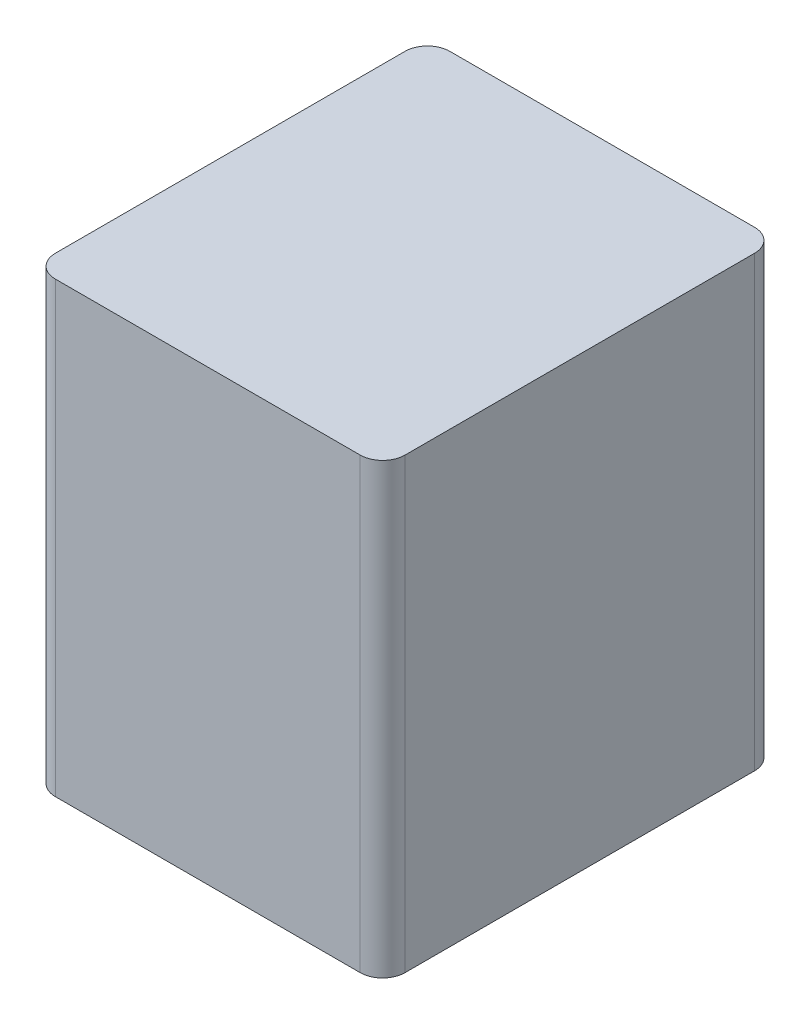
ISO-10303-21;
HEADER;
FILE_DESCRIPTION(('STEP AP214'),'2;1');
FILE_NAME('part.step','',(''),(''),'','','');
FILE_SCHEMA(('AUTOMOTIVE_DESIGN { 1 0 10303 214 1 1 1 1 }'));
ENDSEC;
DATA;
#1=APPLICATION_CONTEXT('core data for automotive mechanical design processes');
#2=APPLICATION_PROTOCOL_DEFINITION('international standard','automotive_design',2000,#1);
#3=PRODUCT_CONTEXT('',#1,'mechanical');
#4=PRODUCT('Part','Part','',(#3));
#5=PRODUCT_RELATED_PRODUCT_CATEGORY('part','',(#4));
#6=PRODUCT_DEFINITION_FORMATION('','',#4);
#7=PRODUCT_DEFINITION_CONTEXT('part definition',#1,'design');
#8=PRODUCT_DEFINITION('design','',#6,#7);
#9=PRODUCT_DEFINITION_SHAPE('','',#8);
#10=(LENGTH_UNIT() NAMED_UNIT(*) SI_UNIT(.MILLI.,.METRE.));
#11=(NAMED_UNIT(*) PLANE_ANGLE_UNIT() SI_UNIT($,.RADIAN.));
#12=(NAMED_UNIT(*) SI_UNIT($,.STERADIAN.) SOLID_ANGLE_UNIT());
#13=UNCERTAINTY_MEASURE_WITH_UNIT(LENGTH_MEASURE(1.E-05),#10,'distance_accuracy_value','');
#14=(GEOMETRIC_REPRESENTATION_CONTEXT(3) GLOBAL_UNCERTAINTY_ASSIGNED_CONTEXT((#13)) GLOBAL_UNIT_ASSIGNED_CONTEXT((#10,
#11,#12)) REPRESENTATION_CONTEXT('',''));
#15=CARTESIAN_POINT('',(0.,0.,0.));
#16=DIRECTION('',(0.,0.,1.));
#17=DIRECTION('',(1.,0.,0.));
#18=AXIS2_PLACEMENT_3D('',#15,#16,#17);
#19=CARTESIAN_POINT('',(57.987324310625,40.859054038768,0.06));
#20=DIRECTION('',(-4.371138828674E-08,1.,0.));
#21=DIRECTION('',(0.,0.,-1.));
#22=AXIS2_PLACEMENT_3D('',#19,#20,#21);
#23=CYLINDRICAL_SURFACE('',#22,0.05);
#24=CARTESIAN_POINT('',(57.9873242887693,41.359054038768,0.0600000000000036));
#25=DIRECTION('',(4.371138828674E-08,-1.,0.));
#26=DIRECTION('',(-1.38777878078145E-13,0.,-1.));
#27=AXIS2_PLACEMENT_3D('',#24,#25,#26);
#28=CIRCLE('',#27,0.05);
#29=CARTESIAN_POINT('',(57.9873242887692,41.3590540387682,0.0100000000000011));
#30=VERTEX_POINT('',#29);
#31=CARTESIAN_POINT('',(58.0373242887692,41.3590540409539,0.06));
#32=VERTEX_POINT('',#31);
#33=EDGE_CURVE('E97',#30,#32,#28,.T.);
#34=ORIENTED_EDGE('',*,*,#33,.T.);
#35=CARTESIAN_POINT('',(58.0373242887693,41.359054040954,0.0600000000000001));
#36=DIRECTION('',(4.37113886753159E-08,-0.999999999999999,0.));
#37=VECTOR('',#36,1.);
#38=LINE('',#35,#37);
#39=CARTESIAN_POINT('',(58.0373243324808,40.3590540409539,0.06));
#40=VERTEX_POINT('',#39);
#41=EDGE_CURVE('E101',#32,#40,#38,.T.);
#42=ORIENTED_EDGE('',*,*,#41,.T.);
#43=CARTESIAN_POINT('',(57.9873243324807,40.359054038768,0.0599999999999964));
#44=DIRECTION('',(-4.371138828674E-08,1.,0.));
#45=DIRECTION('',(0.999999999999999,4.37114233697842E-08,0.));
#46=AXIS2_PLACEMENT_3D('',#43,#44,#45);
#47=CIRCLE('',#46,0.0500000000000015);
#48=CARTESIAN_POINT('',(57.9873243324809,40.3590540387682,0.00999999999999324));
#49=VERTEX_POINT('',#48);
#50=EDGE_CURVE('E81',#40,#49,#47,.T.);
#51=ORIENTED_EDGE('',*,*,#50,.T.);
#52=CARTESIAN_POINT('',(57.9873242887693,41.359054038768,0.00999999999999964));
#53=DIRECTION('',(4.3711381736422E-08,-0.999999999999999,0.));
#54=VECTOR('',#53,1.);
#55=LINE('',#52,#54);
#56=EDGE_CURVE('E109',#30,#49,#55,.T.);
#57=ORIENTED_EDGE('',*,*,#56,.F.);
#58=EDGE_LOOP('',(#34,#42,#51,#57));
#59=FACE_BOUND('',#58,.T.);
#60=ADVANCED_FACE('F16',(#59),#23,.T.);
#61=CARTESIAN_POINT('',(57.987324310625,40.859054038768,0.84));
#62=DIRECTION('',(4.371138828674E-08,-1.,0.));
#63=DIRECTION('',(0.,0.,1.));
#64=AXIS2_PLACEMENT_3D('',#61,#62,#63);
#65=CYLINDRICAL_SURFACE('',#64,0.05);
#66=CARTESIAN_POINT('',(57.9873243324807,40.359054038768,0.84));
#67=DIRECTION('',(-4.371138828674E-08,1.,0.));
#68=DIRECTION('',(0.,0.,1.));
#69=AXIS2_PLACEMENT_3D('',#66,#67,#68);
#70=CIRCLE('',#69,0.05);
#71=CARTESIAN_POINT('',(57.9873243324809,40.3590540387682,0.89));
#72=VERTEX_POINT('',#71);
#73=CARTESIAN_POINT('',(58.0373243324808,40.3590540409539,0.84));
#74=VERTEX_POINT('',#73);
#75=EDGE_CURVE('E268',#72,#74,#70,.T.);
#76=ORIENTED_EDGE('',*,*,#75,.T.);
#77=CARTESIAN_POINT('',(58.0373243324807,40.359054040954,0.84));
#78=DIRECTION('',(-4.37113886753159E-08,0.999999999999999,0.));
#79=VECTOR('',#78,1.);
#80=LINE('',#77,#79);
#81=CARTESIAN_POINT('',(58.0373242887692,41.3590540409539,0.84));
#82=VERTEX_POINT('',#81);
#83=EDGE_CURVE('E108',#74,#82,#80,.T.);
#84=ORIENTED_EDGE('',*,*,#83,.T.);
#85=CARTESIAN_POINT('',(57.9873242887693,41.359054038768,0.84));
#86=DIRECTION('',(4.371138828674E-08,-1.,0.));
#87=DIRECTION('',(0.999999999999999,4.37114233697903E-08,0.));
#88=AXIS2_PLACEMENT_3D('',#85,#86,#87);
#89=CIRCLE('',#88,0.0499999999999945);
#90=CARTESIAN_POINT('',(57.9873242887692,41.3590540387682,0.89));
#91=VERTEX_POINT('',#90);
#92=EDGE_CURVE('E206',#82,#91,#89,.T.);
#93=ORIENTED_EDGE('',*,*,#92,.T.);
#94=CARTESIAN_POINT('',(57.9873243324807,40.359054038768,0.89));
#95=DIRECTION('',(-4.3711381736422E-08,0.999999999999999,0.));
#96=VECTOR('',#95,1.);
#97=LINE('',#94,#96);
#98=EDGE_CURVE('E324',#72,#91,#97,.T.);
#99=ORIENTED_EDGE('',*,*,#98,.F.);
#100=EDGE_LOOP('',(#76,#84,#93,#99));
#101=FACE_BOUND('',#100,.T.);
#102=ADVANCED_FACE('F212',(#101),#65,.T.);
#103=CARTESIAN_POINT('',(58.037324310625,40.859054040954,0.009999999999996));
#104=DIRECTION('',(0.,0.,-1.));
#105=DIRECTION('',(-1.,0.,0.));
#106=AXIS2_PLACEMENT_3D('',#103,#104,#105);
#107=PLANE('',#106);
#108=ORIENTED_EDGE('',*,*,#56,.T.);
#109=CARTESIAN_POINT('',(57.307324332481,40.3590540090447,0.00999999999999195));
#110=DIRECTION('',(0.999999999999999,4.37113886753155E-08,0.));
#111=VECTOR('',#110,1.);
#112=LINE('',#109,#111);
#113=CARTESIAN_POINT('',(57.3073243324809,40.3590540090443,0.00999999999999324));
#114=VERTEX_POINT('',#113);
#115=EDGE_CURVE('E94',#114,#49,#112,.T.);
#116=ORIENTED_EDGE('',*,*,#115,.F.);
#117=CARTESIAN_POINT('',(57.3073242887693,41.359054009044,0.0100000000000036));
#118=DIRECTION('',(4.3711381736422E-08,-0.999999999999999,0.));
#119=VECTOR('',#118,1.);
#120=LINE('',#117,#119);
#121=CARTESIAN_POINT('',(57.3073242887692,41.3590540090443,0.0100000000000011));
#122=VERTEX_POINT('',#121);
#123=EDGE_CURVE('E165',#122,#114,#120,.T.);
#124=ORIENTED_EDGE('',*,*,#123,.F.);
#125=CARTESIAN_POINT('',(57.987324288769,41.3590540387684,0.0100000000000001));
#126=DIRECTION('',(-0.999999999999999,-4.37113784710602E-08,0.));
#127=VECTOR('',#126,1.);
#128=LINE('',#125,#127);
#129=EDGE_CURVE('E176',#30,#122,#128,.T.);
#130=ORIENTED_EDGE('',*,*,#129,.F.);
#131=EDGE_LOOP('',(#108,#116,#124,#130));
#132=FACE_BOUND('',#131,.T.);
#133=ADVANCED_FACE('F136',(#132),#107,.T.);
#134=CARTESIAN_POINT('',(58.037324310625,40.859054040954,0.45));
#135=DIRECTION('',(-1.,-4.371138828674E-08,0.));
#136=DIRECTION('',(-4.371138828674E-08,1.,0.));
#137=AXIS2_PLACEMENT_3D('',#134,#135,#136);
#138=PLANE('',#137);
#139=ORIENTED_EDGE('',*,*,#83,.F.);
#140=CARTESIAN_POINT('',(58.037324332481,40.359054040954,0.06));
#141=DIRECTION('',(0.,0.,1.));
#142=VECTOR('',#141,1.);
#143=LINE('',#140,#142);
#144=EDGE_CURVE('E91',#40,#74,#143,.T.);
#145=ORIENTED_EDGE('',*,*,#144,.F.);
#146=ORIENTED_EDGE('',*,*,#41,.F.);
#147=CARTESIAN_POINT('',(58.037324288769,41.359054040954,0.84));
#148=DIRECTION('',(0.,0.,-1.));
#149=VECTOR('',#148,1.);
#150=LINE('',#147,#149);
#151=EDGE_CURVE('E152',#82,#32,#150,.T.);
#152=ORIENTED_EDGE('',*,*,#151,.F.);
#153=EDGE_LOOP('',(#139,#145,#146,#152));
#154=FACE_BOUND('',#153,.T.);
#155=ADVANCED_FACE('F113',(#154),#138,.F.);
#156=CARTESIAN_POINT('',(58.037324310625,40.859054040954,0.89));
#157=DIRECTION('',(0.,0.,1.));
#158=DIRECTION('',(0.,-1.,0.));
#159=AXIS2_PLACEMENT_3D('',#156,#157,#158);
#160=PLANE('',#159);
#161=CARTESIAN_POINT('',(57.3073243324807,40.359054009044,0.89));
#162=DIRECTION('',(-4.3711381736422E-08,0.999999999999999,0.));
#163=VECTOR('',#162,1.);
#164=LINE('',#161,#163);
#165=CARTESIAN_POINT('',(57.3073243324809,40.3590540090443,0.89));
#166=VERTEX_POINT('',#165);
#167=CARTESIAN_POINT('',(57.3073242887692,41.3590540090443,0.89));
#168=VERTEX_POINT('',#167);
#169=EDGE_CURVE('E328',#166,#168,#164,.T.);
#170=ORIENTED_EDGE('',*,*,#169,.F.);
#171=CARTESIAN_POINT('',(57.987324332481,40.3590540387684,0.89));
#172=DIRECTION('',(-0.999999999999999,-4.37113886753155E-08,0.));
#173=VECTOR('',#172,1.);
#174=LINE('',#171,#173);
#175=EDGE_CURVE('E117',#72,#166,#174,.T.);
#176=ORIENTED_EDGE('',*,*,#175,.F.);
#177=ORIENTED_EDGE('',*,*,#98,.T.);
#178=CARTESIAN_POINT('',(57.307324288769,41.3590540090447,0.89));
#179=DIRECTION('',(0.999999999999999,4.37113886753159E-08,0.));
#180=VECTOR('',#179,1.);
#181=LINE('',#178,#180);
#182=EDGE_CURVE('E568',#168,#91,#181,.T.);
#183=ORIENTED_EDGE('',*,*,#182,.F.);
#184=EDGE_LOOP('',(#170,#176,#177,#183));
#185=FACE_BOUND('',#184,.T.);
#186=ADVANCED_FACE('F135',(#185),#160,.T.);
#187=CARTESIAN_POINT('',(57.307324310625,40.859054009044,0.84));
#188=DIRECTION('',(4.371138828674E-08,-1.,0.));
#189=DIRECTION('',(0.,0.,1.));
#190=AXIS2_PLACEMENT_3D('',#187,#188,#189);
#191=CYLINDRICAL_SURFACE('',#190,0.05);
#192=CARTESIAN_POINT('',(57.307324332481,40.3590540090447,0.89));
#193=CARTESIAN_POINT('',(57.2867075952054,40.3590540081435,0.889773206742566));
#194=CARTESIAN_POINT('',(57.2719689934217,40.3590540074992,0.875355339059327));
#195=CARTESIAN_POINT('',(57.2575581813195,40.3590540068693,0.861258127862108));
#196=CARTESIAN_POINT('',(57.257324332481,40.3590540068591,0.84));
#197=B_SPLINE_CURVE_WITH_KNOTS('',2,(#192,#193,#194,#195,#196),.UNSPECIFIED.,.F.,.F.,(3,2,3),
(0.,0.5,1.),.UNSPECIFIED.);
#198=CARTESIAN_POINT('',(57.2573243324808,40.3590540068589,0.84));
#199=VERTEX_POINT('',#198);
#200=EDGE_CURVE('E505',#166,#199,#197,.T.);
#201=ORIENTED_EDGE('',*,*,#200,.F.);
#202=ORIENTED_EDGE('',*,*,#169,.T.);
#203=CARTESIAN_POINT('',(57.257324288769,41.3590540068591,0.84));
#204=CARTESIAN_POINT('',(57.2575510820264,41.359054006869,0.860616737275509));
#205=CARTESIAN_POINT('',(57.2719689497097,41.3590540074993,0.875355339059327));
#206=CARTESIAN_POINT('',(57.2860661609068,41.3590540081155,0.889766151161536));
#207=CARTESIAN_POINT('',(57.307324288769,41.3590540090447,0.89));
#208=B_SPLINE_CURVE_WITH_KNOTS('',2,(#203,#204,#205,#206,#207),.UNSPECIFIED.,.F.,.F.,(3,2,3),
(0.,0.5,1.),.UNSPECIFIED.);
#209=CARTESIAN_POINT('',(57.2573242887692,41.3590540068589,0.84));
#210=VERTEX_POINT('',#209);
#211=EDGE_CURVE('E575',#210,#168,#208,.T.);
#212=ORIENTED_EDGE('',*,*,#211,.F.);
#213=CARTESIAN_POINT('',(57.2573243324807,40.359054006859,0.840000000000001));
#214=DIRECTION('',(-4.3711381736422E-08,0.999999999999999,0.));
#215=VECTOR('',#214,1.);
#216=LINE('',#213,#215);
#217=EDGE_CURVE('E512',#199,#210,#216,.T.);
#218=ORIENTED_EDGE('',*,*,#217,.F.);
#219=EDGE_LOOP('',(#201,#202,#212,#218));
#220=FACE_BOUND('',#219,.T.);
#221=ADVANCED_FACE('F394',(#220),#191,.T.);
#222=CARTESIAN_POINT('',(58.037324288769,41.359054040954,0.45));
#223=DIRECTION('',(-4.371138828674E-08,1.,0.));
#224=DIRECTION('',(-2.77800930324677E-07,0.,0.999999999999961));
#225=AXIS2_PLACEMENT_3D('',#222,#223,#224);
#226=PLANE('',#225);
#227=ORIENTED_EDGE('',*,*,#211,.T.);
#228=ORIENTED_EDGE('',*,*,#182,.T.);
#229=ORIENTED_EDGE('',*,*,#92,.F.);
#230=ORIENTED_EDGE('',*,*,#151,.T.);
#231=ORIENTED_EDGE('',*,*,#33,.F.);
#232=ORIENTED_EDGE('',*,*,#129,.T.);
#233=CARTESIAN_POINT('',(57.3073242887693,41.359054009044,0.0600000000000036));
#234=DIRECTION('',(4.371138828674E-08,-1.,0.));
#235=DIRECTION('',(-0.999999999999999,-4.37114233697842E-08,0.));
#236=AXIS2_PLACEMENT_3D('',#233,#234,#235);
#237=CIRCLE('',#236,0.0500000000000015);
#238=CARTESIAN_POINT('',(57.2573242887692,41.3590540068589,0.06));
#239=VERTEX_POINT('',#238);
#240=EDGE_CURVE('E563',#239,#122,#237,.T.);
#241=ORIENTED_EDGE('',*,*,#240,.F.);
#242=CARTESIAN_POINT('',(57.2573242887693,41.359054006859,0.840000000000001));
#243=DIRECTION('',(0.,0.,-1.));
#244=VECTOR('',#243,1.);
#245=LINE('',#242,#244);
#246=EDGE_CURVE('E546',#210,#239,#245,.T.);
#247=ORIENTED_EDGE('',*,*,#246,.F.);
#248=EDGE_LOOP('',(#227,#228,#229,#230,#231,#232,#241,#247));
#249=FACE_BOUND('',#248,.T.);
#250=ADVANCED_FACE('F405',(#249),#226,.T.);
#251=CARTESIAN_POINT('',(57.307324310625,40.859054009044,0.06));
#252=DIRECTION('',(-4.371138828674E-08,1.,0.));
#253=DIRECTION('',(0.,0.,-1.));
#254=AXIS2_PLACEMENT_3D('',#251,#252,#253);
#255=CYLINDRICAL_SURFACE('',#254,0.05);
#256=ORIENTED_EDGE('',*,*,#240,.T.);
#257=ORIENTED_EDGE('',*,*,#123,.T.);
#258=CARTESIAN_POINT('',(57.257324332481,40.3590540068591,0.06));
#259=CARTESIAN_POINT('',(57.2575511257384,40.359054006869,0.039383262724352));
#260=CARTESIAN_POINT('',(57.2719689934217,40.3590540074992,0.024644660940666));
#261=CARTESIAN_POINT('',(57.286066204619,40.3590540081155,0.010233848838451));
#262=CARTESIAN_POINT('',(57.307324332481,40.3590540090447,0.00999999999999));
#263=B_SPLINE_CURVE_WITH_KNOTS('',2,(#258,#259,#260,#261,#262),.UNSPECIFIED.,.F.,.F.,(3,2,3),
(0.,0.5,1.),.UNSPECIFIED.);
#264=CARTESIAN_POINT('',(57.2573243324808,40.3590540068589,0.06));
#265=VERTEX_POINT('',#264);
#266=EDGE_CURVE('E36',#265,#114,#263,.T.);
#267=ORIENTED_EDGE('',*,*,#266,.F.);
#268=CARTESIAN_POINT('',(57.2573242887693,41.359054006859,0.0599999999999992));
#269=DIRECTION('',(4.3711381736422E-08,-0.999999999999999,0.));
#270=VECTOR('',#269,1.);
#271=LINE('',#268,#270);
#272=EDGE_CURVE('E28',#239,#265,#271,.T.);
#273=ORIENTED_EDGE('',*,*,#272,.F.);
#274=EDGE_LOOP('',(#256,#257,#267,#273));
#275=FACE_BOUND('',#274,.T.);
#276=ADVANCED_FACE('F417',(#275),#255,.T.);
#277=CARTESIAN_POINT('',(58.037324332481,40.359054040954,0.45));
#278=DIRECTION('',(4.371138828674E-08,-1.,0.));
#279=DIRECTION('',(0.,0.,-1.));
#280=AXIS2_PLACEMENT_3D('',#277,#278,#279);
#281=PLANE('',#280);
#282=ORIENTED_EDGE('',*,*,#200,.T.);
#283=CARTESIAN_POINT('',(57.2573243324807,40.359054006859,0.0599999999999992));
#284=DIRECTION('',(0.,0.,1.));
#285=VECTOR('',#284,1.);
#286=LINE('',#283,#285);
#287=EDGE_CURVE('E11',#265,#199,#286,.T.);
#288=ORIENTED_EDGE('',*,*,#287,.F.);
#289=ORIENTED_EDGE('',*,*,#266,.T.);
#290=ORIENTED_EDGE('',*,*,#115,.T.);
#291=ORIENTED_EDGE('',*,*,#50,.F.);
#292=ORIENTED_EDGE('',*,*,#144,.T.);
#293=ORIENTED_EDGE('',*,*,#75,.F.);
#294=ORIENTED_EDGE('',*,*,#175,.T.);
#295=EDGE_LOOP('',(#282,#288,#289,#290,#291,#292,#293,#294));
#296=FACE_BOUND('',#295,.T.);
#297=ADVANCED_FACE('F89',(#296),#281,.T.);
#298=CARTESIAN_POINT('',(57.257324310625,40.859054006859,0.45));
#299=DIRECTION('',(-1.,-4.371138828674E-08,0.));
#300=DIRECTION('',(-4.371138828674E-08,1.,0.));
#301=AXIS2_PLACEMENT_3D('',#298,#299,#300);
#302=PLANE('',#301);
#303=ORIENTED_EDGE('',*,*,#272,.T.);
#304=ORIENTED_EDGE('',*,*,#287,.T.);
#305=ORIENTED_EDGE('',*,*,#217,.T.);
#306=ORIENTED_EDGE('',*,*,#246,.T.);
#307=EDGE_LOOP('',(#303,#304,#305,#306));
#308=FACE_BOUND('',#307,.T.);
#309=ADVANCED_FACE('F441',(#308),#302,.T.);
#310=CLOSED_SHELL('',(#60,#102,#133,#155,#186,#221,#250,#276,#297,#309));
#311=MANIFOLD_SOLID_BREP('B1',#310);
#312=ADVANCED_BREP_SHAPE_REPRESENTATION('',(#18,#311),#14);
#313=SHAPE_DEFINITION_REPRESENTATION(#9,#312);
ENDSEC;
END-ISO-10303-21;
